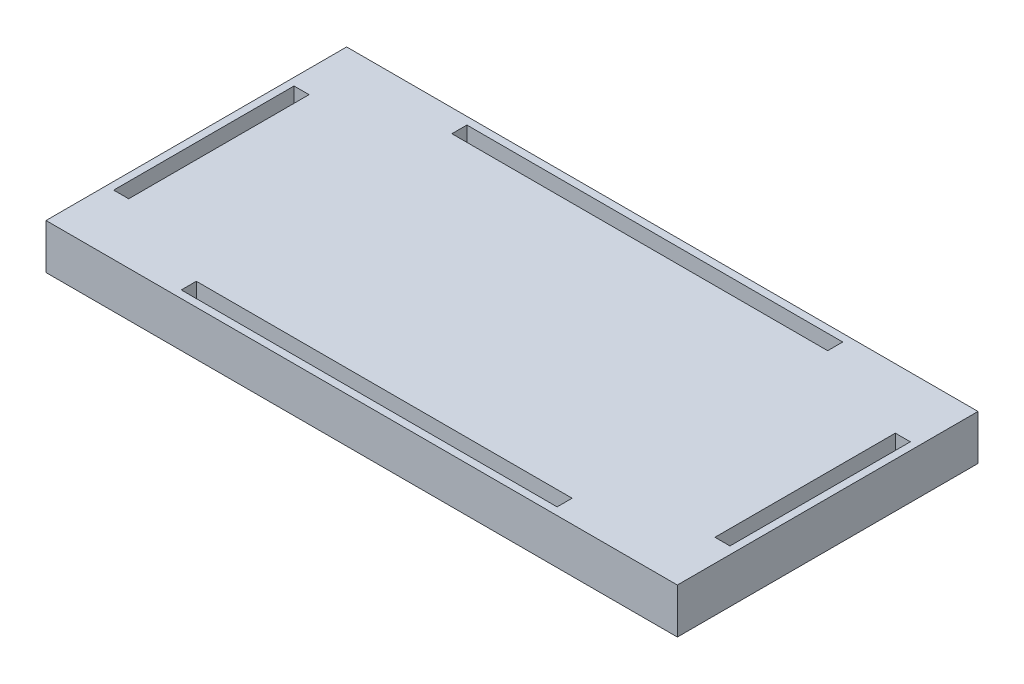
ISO-10303-21;
HEADER;
FILE_DESCRIPTION(('STEP AP214'),'2;1');
FILE_NAME('part.step','',(''),(''),'','','');
FILE_SCHEMA(('AUTOMOTIVE_DESIGN { 1 0 10303 214 1 1 1 1 }'));
ENDSEC;
DATA;
#1=APPLICATION_CONTEXT('core data for automotive mechanical design processes');
#2=APPLICATION_PROTOCOL_DEFINITION('international standard','automotive_design',2000,#1);
#3=PRODUCT_CONTEXT('',#1,'mechanical');
#4=PRODUCT('Part','Part','',(#3));
#5=PRODUCT_RELATED_PRODUCT_CATEGORY('part','',(#4));
#6=PRODUCT_DEFINITION_FORMATION('','',#4);
#7=PRODUCT_DEFINITION_CONTEXT('part definition',#1,'design');
#8=PRODUCT_DEFINITION('design','',#6,#7);
#9=PRODUCT_DEFINITION_SHAPE('','',#8);
#10=(LENGTH_UNIT() NAMED_UNIT(*) SI_UNIT(.MILLI.,.METRE.));
#11=(NAMED_UNIT(*) PLANE_ANGLE_UNIT() SI_UNIT($,.RADIAN.));
#12=(NAMED_UNIT(*) SI_UNIT($,.STERADIAN.) SOLID_ANGLE_UNIT());
#13=UNCERTAINTY_MEASURE_WITH_UNIT(LENGTH_MEASURE(1.E-05),#10,'distance_accuracy_value','');
#14=(GEOMETRIC_REPRESENTATION_CONTEXT(3) GLOBAL_UNCERTAINTY_ASSIGNED_CONTEXT((#13)) GLOBAL_UNIT_ASSIGNED_CONTEXT((#10,
#11,#12)) REPRESENTATION_CONTEXT('',''));
#15=CARTESIAN_POINT('',(0.,0.,0.));
#16=DIRECTION('',(0.,0.,1.));
#17=DIRECTION('',(1.,0.,0.));
#18=AXIS2_PLACEMENT_3D('',#15,#16,#17);
#19=CARTESIAN_POINT('',(103.,15.,50.));
#20=DIRECTION('',(0.,0.,-1.));
#21=DIRECTION('',(-1.,0.,0.));
#22=AXIS2_PLACEMENT_3D('',#19,#20,#21);
#23=PLANE('',#22);
#24=DIRECTION('',(1.,0.,0.));
#25=VECTOR('',#24,1.);
#26=CARTESIAN_POINT('',(103.,0.,50.));
#27=LINE('',#26,#25);
#28=CARTESIAN_POINT('',(-105.,0.,50.));
#29=VERTEX_POINT('',#28);
#30=CARTESIAN_POINT('',(105.,0.,50.));
#31=VERTEX_POINT('',#30);
#32=EDGE_CURVE('E211',#29,#31,#27,.T.);
#33=ORIENTED_EDGE('',*,*,#32,.T.);
#34=DIRECTION('',(0.,-1.,0.));
#35=VECTOR('',#34,1.);
#36=CARTESIAN_POINT('',(105.,15.,50.));
#37=LINE('',#36,#35);
#38=CARTESIAN_POINT('',(105.,15.,50.));
#39=VERTEX_POINT('',#38);
#40=EDGE_CURVE('E46',#39,#31,#37,.T.);
#41=ORIENTED_EDGE('',*,*,#40,.F.);
#42=DIRECTION('',(1.,0.,0.));
#43=VECTOR('',#42,1.);
#44=CARTESIAN_POINT('',(-105.,15.,50.));
#45=LINE('',#44,#43);
#46=CARTESIAN_POINT('',(-105.,15.,50.));
#47=VERTEX_POINT('',#46);
#48=EDGE_CURVE('E311',#47,#39,#45,.T.);
#49=ORIENTED_EDGE('',*,*,#48,.F.);
#50=DIRECTION('',(0.,-1.,0.));
#51=VECTOR('',#50,1.);
#52=CARTESIAN_POINT('',(-105.,15.,50.));
#53=LINE('',#52,#51);
#54=EDGE_CURVE('E11',#47,#29,#53,.T.);
#55=ORIENTED_EDGE('',*,*,#54,.T.);
#56=EDGE_LOOP('',(#33,#41,#49,#55));
#57=FACE_BOUND('',#56,.T.);
#58=ADVANCED_FACE('F39',(#57),#23,.F.);
#59=CARTESIAN_POINT('',(105.,15.,-48.));
#60=DIRECTION('',(-1.,0.,0.));
#61=DIRECTION('',(0.,0.,1.));
#62=AXIS2_PLACEMENT_3D('',#59,#60,#61);
#63=PLANE('',#62);
#64=DIRECTION('',(0.,0.,-1.));
#65=VECTOR('',#64,1.);
#66=CARTESIAN_POINT('',(105.,0.,-48.));
#67=LINE('',#66,#65);
#68=CARTESIAN_POINT('',(105.,0.,-50.));
#69=VERTEX_POINT('',#68);
#70=EDGE_CURVE('E321',#31,#69,#67,.T.);
#71=ORIENTED_EDGE('',*,*,#70,.T.);
#72=DIRECTION('',(0.,-1.,0.));
#73=VECTOR('',#72,1.);
#74=CARTESIAN_POINT('',(105.,15.,-50.));
#75=LINE('',#74,#73);
#76=CARTESIAN_POINT('',(105.,15.,-50.));
#77=VERTEX_POINT('',#76);
#78=EDGE_CURVE('E329',#77,#69,#75,.T.);
#79=ORIENTED_EDGE('',*,*,#78,.F.);
#80=DIRECTION('',(0.,0.,-1.));
#81=VECTOR('',#80,1.);
#82=CARTESIAN_POINT('',(105.,15.,50.));
#83=LINE('',#82,#81);
#84=EDGE_CURVE('E314',#39,#77,#83,.T.);
#85=ORIENTED_EDGE('',*,*,#84,.F.);
#86=ORIENTED_EDGE('',*,*,#40,.T.);
#87=EDGE_LOOP('',(#71,#79,#85,#86));
#88=FACE_BOUND('',#87,.T.);
#89=ADVANCED_FACE('F335',(#88),#63,.F.);
#90=CARTESIAN_POINT('',(-105.,15.,-50.));
#91=DIRECTION('',(0.,0.,-1.));
#92=DIRECTION('',(-1.,0.,0.));
#93=AXIS2_PLACEMENT_3D('',#90,#91,#92);
#94=PLANE('',#93);
#95=DIRECTION('',(1.,0.,0.));
#96=VECTOR('',#95,1.);
#97=CARTESIAN_POINT('',(-105.,0.,-50.));
#98=LINE('',#97,#96);
#99=CARTESIAN_POINT('',(-105.,0.,-50.));
#100=VERTEX_POINT('',#99);
#101=EDGE_CURVE('E324',#100,#69,#98,.T.);
#102=ORIENTED_EDGE('',*,*,#101,.F.);
#103=DIRECTION('',(0.,-1.,0.));
#104=VECTOR('',#103,1.);
#105=CARTESIAN_POINT('',(-105.,15.,-50.));
#106=LINE('',#105,#104);
#107=CARTESIAN_POINT('',(-105.,15.,-50.));
#108=VERTEX_POINT('',#107);
#109=EDGE_CURVE('E318',#108,#100,#106,.T.);
#110=ORIENTED_EDGE('',*,*,#109,.F.);
#111=DIRECTION('',(-1.,0.,0.));
#112=VECTOR('',#111,1.);
#113=CARTESIAN_POINT('',(105.,15.,-50.));
#114=LINE('',#113,#112);
#115=EDGE_CURVE('E316',#77,#108,#114,.T.);
#116=ORIENTED_EDGE('',*,*,#115,.F.);
#117=ORIENTED_EDGE('',*,*,#78,.T.);
#118=EDGE_LOOP('',(#102,#110,#116,#117));
#119=FACE_BOUND('',#118,.T.);
#120=ADVANCED_FACE('F349',(#119),#94,.T.);
#121=CARTESIAN_POINT('',(-105.,15.,48.));
#122=DIRECTION('',(-1.,0.,0.));
#123=DIRECTION('',(0.,0.,1.));
#124=AXIS2_PLACEMENT_3D('',#121,#122,#123);
#125=PLANE('',#124);
#126=DIRECTION('',(0.,0.,-1.));
#127=VECTOR('',#126,1.);
#128=CARTESIAN_POINT('',(-105.,0.,48.));
#129=LINE('',#128,#127);
#130=EDGE_CURVE('E312',#29,#100,#129,.T.);
#131=ORIENTED_EDGE('',*,*,#130,.F.);
#132=ORIENTED_EDGE('',*,*,#54,.F.);
#133=DIRECTION('',(0.,0.,1.));
#134=VECTOR('',#133,1.);
#135=CARTESIAN_POINT('',(-105.,15.,48.));
#136=LINE('',#135,#134);
#137=EDGE_CURVE('E308',#108,#47,#136,.T.);
#138=ORIENTED_EDGE('',*,*,#137,.F.);
#139=ORIENTED_EDGE('',*,*,#109,.T.);
#140=EDGE_LOOP('',(#131,#132,#138,#139));
#141=FACE_BOUND('',#140,.T.);
#142=ADVANCED_FACE('F343',(#141),#125,.T.);
#143=CARTESIAN_POINT('',(0.,15.,0.));
#144=DIRECTION('',(0.,1.,0.));
#145=DIRECTION('',(0.,0.,1.));
#146=AXIS2_PLACEMENT_3D('',#143,#144,#145);
#147=PLANE('',#146);
#148=DIRECTION('',(0.,0.,1.));
#149=VECTOR('',#148,1.);
#150=CARTESIAN_POINT('',(-102.5,15.,30.0000000000001));
#151=LINE('',#150,#149);
#152=CARTESIAN_POINT('',(-102.5,15.,-29.9999999999999));
#153=VERTEX_POINT('',#152);
#154=CARTESIAN_POINT('',(-102.5,15.,30.0000000000001));
#155=VERTEX_POINT('',#154);
#156=EDGE_CURVE('E53',#153,#155,#151,.T.);
#157=ORIENTED_EDGE('',*,*,#156,.F.);
#158=DIRECTION('',(-1.,0.,0.));
#159=VECTOR('',#158,1.);
#160=CARTESIAN_POINT('',(-97.5,15.,-29.9999999999999));
#161=LINE('',#160,#159);
#162=CARTESIAN_POINT('',(-97.5,15.,-29.9999999999999));
#163=VERTEX_POINT('',#162);
#164=EDGE_CURVE('E195',#163,#153,#161,.T.);
#165=ORIENTED_EDGE('',*,*,#164,.F.);
#166=DIRECTION('',(0.,0.,-1.));
#167=VECTOR('',#166,1.);
#168=CARTESIAN_POINT('',(-97.5,15.,30.0000000000001));
#169=LINE('',#168,#167);
#170=CARTESIAN_POINT('',(-97.5,15.,30.0000000000001));
#171=VERTEX_POINT('',#170);
#172=EDGE_CURVE('E198',#171,#163,#169,.T.);
#173=ORIENTED_EDGE('',*,*,#172,.F.);
#174=DIRECTION('',(1.,0.,0.));
#175=VECTOR('',#174,1.);
#176=CARTESIAN_POINT('',(-97.5,15.,30.0000000000001));
#177=LINE('',#176,#175);
#178=EDGE_CURVE('E204',#155,#171,#177,.T.);
#179=ORIENTED_EDGE('',*,*,#178,.F.);
#180=EDGE_LOOP('',(#157,#165,#173,#179));
#181=FACE_BOUND('',#180,.T.);
#182=DIRECTION('',(0.,0.,1.));
#183=VECTOR('',#182,1.);
#184=CARTESIAN_POINT('',(97.5000000000001,15.,30.0000000000001));
#185=LINE('',#184,#183);
#186=CARTESIAN_POINT('',(97.5000000000001,15.,-29.9999999999999));
#187=VERTEX_POINT('',#186);
#188=CARTESIAN_POINT('',(97.5000000000001,15.,30.0000000000001));
#189=VERTEX_POINT('',#188);
#190=EDGE_CURVE('E61',#187,#189,#185,.T.);
#191=ORIENTED_EDGE('',*,*,#190,.F.);
#192=DIRECTION('',(-1.,0.,0.));
#193=VECTOR('',#192,1.);
#194=CARTESIAN_POINT('',(97.5000000000001,15.,-29.9999999999999));
#195=LINE('',#194,#193);
#196=CARTESIAN_POINT('',(102.5,15.,-29.9999999999999));
#197=VERTEX_POINT('',#196);
#198=EDGE_CURVE('E219',#197,#187,#195,.T.);
#199=ORIENTED_EDGE('',*,*,#198,.F.);
#200=DIRECTION('',(0.,0.,-1.));
#201=VECTOR('',#200,1.);
#202=CARTESIAN_POINT('',(102.5,15.,30.0000000000001));
#203=LINE('',#202,#201);
#204=CARTESIAN_POINT('',(102.5,15.,30.0000000000001));
#205=VERTEX_POINT('',#204);
#206=EDGE_CURVE('E234',#205,#197,#203,.T.);
#207=ORIENTED_EDGE('',*,*,#206,.F.);
#208=DIRECTION('',(1.,0.,0.));
#209=VECTOR('',#208,1.);
#210=CARTESIAN_POINT('',(97.5000000000001,15.,30.0000000000001));
#211=LINE('',#210,#209);
#212=EDGE_CURVE('E230',#189,#205,#211,.T.);
#213=ORIENTED_EDGE('',*,*,#212,.F.);
#214=EDGE_LOOP('',(#191,#199,#207,#213));
#215=FACE_BOUND('',#214,.T.);
#216=DIRECTION('',(0.,0.,1.));
#217=VECTOR('',#216,1.);
#218=CARTESIAN_POINT('',(-62.4999999999999,15.,-42.5));
#219=LINE('',#218,#217);
#220=CARTESIAN_POINT('',(-62.4999999999999,15.,-47.5));
#221=VERTEX_POINT('',#220);
#222=CARTESIAN_POINT('',(-62.4999999999999,15.,-42.5));
#223=VERTEX_POINT('',#222);
#224=EDGE_CURVE('E259',#221,#223,#219,.T.);
#225=ORIENTED_EDGE('',*,*,#224,.F.);
#226=DIRECTION('',(-1.,0.,0.));
#227=VECTOR('',#226,1.);
#228=CARTESIAN_POINT('',(62.5000000000001,15.,-47.5));
#229=LINE('',#228,#227);
#230=CARTESIAN_POINT('',(62.5000000000001,15.,-47.5));
#231=VERTEX_POINT('',#230);
#232=EDGE_CURVE('E249',#231,#221,#229,.T.);
#233=ORIENTED_EDGE('',*,*,#232,.F.);
#234=DIRECTION('',(0.,0.,-1.));
#235=VECTOR('',#234,1.);
#236=CARTESIAN_POINT('',(62.5000000000001,15.,-42.5));
#237=LINE('',#236,#235);
#238=CARTESIAN_POINT('',(62.5000000000001,15.,-42.5));
#239=VERTEX_POINT('',#238);
#240=EDGE_CURVE('E265',#239,#231,#237,.T.);
#241=ORIENTED_EDGE('',*,*,#240,.F.);
#242=DIRECTION('',(1.,0.,0.));
#243=VECTOR('',#242,1.);
#244=CARTESIAN_POINT('',(62.5000000000001,15.,-42.5));
#245=LINE('',#244,#243);
#246=EDGE_CURVE('E261',#223,#239,#245,.T.);
#247=ORIENTED_EDGE('',*,*,#246,.F.);
#248=EDGE_LOOP('',(#225,#233,#241,#247));
#249=FACE_BOUND('',#248,.T.);
#250=DIRECTION('',(0.,0.,-1.));
#251=VECTOR('',#250,1.);
#252=CARTESIAN_POINT('',(62.5000000000001,15.,42.5));
#253=LINE('',#252,#251);
#254=CARTESIAN_POINT('',(62.5000000000001,15.,47.5));
#255=VERTEX_POINT('',#254);
#256=CARTESIAN_POINT('',(62.5000000000001,15.,42.5));
#257=VERTEX_POINT('',#256);
#258=EDGE_CURVE('E291',#255,#257,#253,.T.);
#259=ORIENTED_EDGE('',*,*,#258,.F.);
#260=DIRECTION('',(1.,0.,0.));
#261=VECTOR('',#260,1.);
#262=CARTESIAN_POINT('',(62.5000000000001,15.,47.5));
#263=LINE('',#262,#261);
#264=CARTESIAN_POINT('',(-62.4999999999999,15.,47.5));
#265=VERTEX_POINT('',#264);
#266=EDGE_CURVE('E281',#265,#255,#263,.T.);
#267=ORIENTED_EDGE('',*,*,#266,.F.);
#268=DIRECTION('',(0.,0.,1.));
#269=VECTOR('',#268,1.);
#270=CARTESIAN_POINT('',(-62.4999999999999,15.,42.5));
#271=LINE('',#270,#269);
#272=CARTESIAN_POINT('',(-62.4999999999999,15.,42.5));
#273=VERTEX_POINT('',#272);
#274=EDGE_CURVE('E296',#273,#265,#271,.T.);
#275=ORIENTED_EDGE('',*,*,#274,.F.);
#276=DIRECTION('',(-1.,0.,0.));
#277=VECTOR('',#276,1.);
#278=CARTESIAN_POINT('',(62.5000000000001,15.,42.5));
#279=LINE('',#278,#277);
#280=EDGE_CURVE('E293',#257,#273,#279,.T.);
#281=ORIENTED_EDGE('',*,*,#280,.F.);
#282=EDGE_LOOP('',(#259,#267,#275,#281));
#283=FACE_BOUND('',#282,.T.);
#284=ORIENTED_EDGE('',*,*,#137,.T.);
#285=ORIENTED_EDGE('',*,*,#48,.T.);
#286=ORIENTED_EDGE('',*,*,#84,.T.);
#287=ORIENTED_EDGE('',*,*,#115,.T.);
#288=EDGE_LOOP('',(#284,#285,#286,#287));
#289=FACE_BOUND('',#288,.T.);
#290=ADVANCED_FACE('F351',(#181,#215,#249,#283,#289),#147,.T.);
#291=CARTESIAN_POINT('',(0.,0.,0.));
#292=DIRECTION('',(0.,1.,0.));
#293=DIRECTION('',(0.,0.,1.));
#294=AXIS2_PLACEMENT_3D('',#291,#292,#293);
#295=PLANE('',#294);
#296=ORIENTED_EDGE('',*,*,#32,.F.);
#297=ORIENTED_EDGE('',*,*,#130,.T.);
#298=ORIENTED_EDGE('',*,*,#101,.T.);
#299=ORIENTED_EDGE('',*,*,#70,.F.);
#300=EDGE_LOOP('',(#296,#297,#298,#299));
#301=FACE_BOUND('',#300,.T.);
#302=ADVANCED_FACE('F341',(#301),#295,.F.);
#303=CARTESIAN_POINT('',(62.5000000000001,10.,42.5));
#304=DIRECTION('',(1.,0.,0.));
#305=DIRECTION('',(0.,0.,-1.));
#306=AXIS2_PLACEMENT_3D('',#303,#304,#305);
#307=PLANE('',#306);
#308=ORIENTED_EDGE('',*,*,#258,.T.);
#309=DIRECTION('',(0.,1.,0.));
#310=VECTOR('',#309,1.);
#311=CARTESIAN_POINT('',(62.5000000000001,10.,42.5));
#312=LINE('',#311,#310);
#313=CARTESIAN_POINT('',(62.5000000000001,10.,42.5));
#314=VERTEX_POINT('',#313);
#315=EDGE_CURVE('E290',#314,#257,#312,.T.);
#316=ORIENTED_EDGE('',*,*,#315,.F.);
#317=DIRECTION('',(0.,0.,-1.));
#318=VECTOR('',#317,1.);
#319=CARTESIAN_POINT('',(62.5000000000001,10.,42.5));
#320=LINE('',#319,#318);
#321=CARTESIAN_POINT('',(62.5000000000001,10.,47.5));
#322=VERTEX_POINT('',#321);
#323=EDGE_CURVE('E277',#322,#314,#320,.T.);
#324=ORIENTED_EDGE('',*,*,#323,.F.);
#325=DIRECTION('',(0.,1.,0.));
#326=VECTOR('',#325,1.);
#327=CARTESIAN_POINT('',(62.5000000000001,10.,47.5));
#328=LINE('',#327,#326);
#329=EDGE_CURVE('E262',#322,#255,#328,.T.);
#330=ORIENTED_EDGE('',*,*,#329,.T.);
#331=EDGE_LOOP('',(#308,#316,#324,#330));
#332=FACE_BOUND('',#331,.T.);
#333=ADVANCED_FACE('F359',(#332),#307,.F.);
#334=CARTESIAN_POINT('',(62.5000000000001,10.,47.5));
#335=DIRECTION('',(0.,0.,1.));
#336=DIRECTION('',(1.,0.,0.));
#337=AXIS2_PLACEMENT_3D('',#334,#335,#336);
#338=PLANE('',#337);
#339=ORIENTED_EDGE('',*,*,#266,.T.);
#340=ORIENTED_EDGE('',*,*,#329,.F.);
#341=DIRECTION('',(1.,0.,0.));
#342=VECTOR('',#341,1.);
#343=CARTESIAN_POINT('',(62.5000000000001,10.,47.5));
#344=LINE('',#343,#342);
#345=CARTESIAN_POINT('',(-62.4999999999999,10.,47.5));
#346=VERTEX_POINT('',#345);
#347=EDGE_CURVE('E287',#346,#322,#344,.T.);
#348=ORIENTED_EDGE('',*,*,#347,.F.);
#349=DIRECTION('',(0.,1.,0.));
#350=VECTOR('',#349,1.);
#351=CARTESIAN_POINT('',(-62.4999999999999,10.,47.5));
#352=LINE('',#351,#350);
#353=EDGE_CURVE('E302',#346,#265,#352,.T.);
#354=ORIENTED_EDGE('',*,*,#353,.T.);
#355=EDGE_LOOP('',(#339,#340,#348,#354));
#356=FACE_BOUND('',#355,.T.);
#357=ADVANCED_FACE('F394',(#356),#338,.F.);
#358=CARTESIAN_POINT('',(-62.4999999999999,10.,42.5));
#359=DIRECTION('',(-1.,0.,0.));
#360=DIRECTION('',(0.,0.,1.));
#361=AXIS2_PLACEMENT_3D('',#358,#359,#360);
#362=PLANE('',#361);
#363=ORIENTED_EDGE('',*,*,#274,.T.);
#364=ORIENTED_EDGE('',*,*,#353,.F.);
#365=DIRECTION('',(0.,0.,1.));
#366=VECTOR('',#365,1.);
#367=CARTESIAN_POINT('',(-62.4999999999999,10.,42.5));
#368=LINE('',#367,#366);
#369=CARTESIAN_POINT('',(-62.4999999999999,10.,42.5));
#370=VERTEX_POINT('',#369);
#371=EDGE_CURVE('E284',#370,#346,#368,.T.);
#372=ORIENTED_EDGE('',*,*,#371,.F.);
#373=DIRECTION('',(0.,1.,0.));
#374=VECTOR('',#373,1.);
#375=CARTESIAN_POINT('',(-62.4999999999999,10.,42.5));
#376=LINE('',#375,#374);
#377=EDGE_CURVE('E304',#370,#273,#376,.T.);
#378=ORIENTED_EDGE('',*,*,#377,.T.);
#379=EDGE_LOOP('',(#363,#364,#372,#378));
#380=FACE_BOUND('',#379,.T.);
#381=ADVANCED_FACE('F401',(#380),#362,.F.);
#382=CARTESIAN_POINT('',(62.5000000000001,10.,42.5));
#383=DIRECTION('',(0.,0.,-1.));
#384=DIRECTION('',(-1.,0.,0.));
#385=AXIS2_PLACEMENT_3D('',#382,#383,#384);
#386=PLANE('',#385);
#387=ORIENTED_EDGE('',*,*,#280,.T.);
#388=ORIENTED_EDGE('',*,*,#377,.F.);
#389=DIRECTION('',(-1.,0.,0.));
#390=VECTOR('',#389,1.);
#391=CARTESIAN_POINT('',(62.5000000000001,10.,42.5));
#392=LINE('',#391,#390);
#393=EDGE_CURVE('E280',#314,#370,#392,.T.);
#394=ORIENTED_EDGE('',*,*,#393,.F.);
#395=ORIENTED_EDGE('',*,*,#315,.T.);
#396=EDGE_LOOP('',(#387,#388,#394,#395));
#397=FACE_BOUND('',#396,.T.);
#398=ADVANCED_FACE('F409',(#397),#386,.F.);
#399=CARTESIAN_POINT('',(0.,10.,0.));
#400=DIRECTION('',(0.,-1.,0.));
#401=DIRECTION('',(0.,0.,-1.));
#402=AXIS2_PLACEMENT_3D('',#399,#400,#401);
#403=PLANE('',#402);
#404=ORIENTED_EDGE('',*,*,#323,.T.);
#405=ORIENTED_EDGE('',*,*,#393,.T.);
#406=ORIENTED_EDGE('',*,*,#371,.T.);
#407=ORIENTED_EDGE('',*,*,#347,.T.);
#408=EDGE_LOOP('',(#404,#405,#406,#407));
#409=FACE_BOUND('',#408,.T.);
#410=ADVANCED_FACE('F417',(#409),#403,.F.);
#411=CARTESIAN_POINT('',(-62.4999999999999,10.,-42.5));
#412=DIRECTION('',(-1.,0.,0.));
#413=DIRECTION('',(0.,0.,1.));
#414=AXIS2_PLACEMENT_3D('',#411,#412,#413);
#415=PLANE('',#414);
#416=ORIENTED_EDGE('',*,*,#224,.T.);
#417=DIRECTION('',(0.,1.,0.));
#418=VECTOR('',#417,1.);
#419=CARTESIAN_POINT('',(-62.4999999999999,10.,-42.5));
#420=LINE('',#419,#418);
#421=CARTESIAN_POINT('',(-62.4999999999999,10.,-42.5));
#422=VERTEX_POINT('',#421);
#423=EDGE_CURVE('E258',#422,#223,#420,.T.);
#424=ORIENTED_EDGE('',*,*,#423,.F.);
#425=DIRECTION('',(0.,0.,1.));
#426=VECTOR('',#425,1.);
#427=CARTESIAN_POINT('',(-62.4999999999999,10.,-42.5));
#428=LINE('',#427,#426);
#429=CARTESIAN_POINT('',(-62.4999999999999,10.,-47.5));
#430=VERTEX_POINT('',#429);
#431=EDGE_CURVE('E245',#430,#422,#428,.T.);
#432=ORIENTED_EDGE('',*,*,#431,.F.);
#433=DIRECTION('',(0.,1.,0.));
#434=VECTOR('',#433,1.);
#435=CARTESIAN_POINT('',(-62.4999999999999,10.,-47.5));
#436=LINE('',#435,#434);
#437=EDGE_CURVE('E231',#430,#221,#436,.T.);
#438=ORIENTED_EDGE('',*,*,#437,.T.);
#439=EDGE_LOOP('',(#416,#424,#432,#438));
#440=FACE_BOUND('',#439,.T.);
#441=ADVANCED_FACE('F425',(#440),#415,.F.);
#442=CARTESIAN_POINT('',(62.5000000000001,10.,-47.5));
#443=DIRECTION('',(0.,0.,-1.));
#444=DIRECTION('',(-1.,0.,0.));
#445=AXIS2_PLACEMENT_3D('',#442,#443,#444);
#446=PLANE('',#445);
#447=ORIENTED_EDGE('',*,*,#232,.T.);
#448=ORIENTED_EDGE('',*,*,#437,.F.);
#449=DIRECTION('',(-1.,0.,0.));
#450=VECTOR('',#449,1.);
#451=CARTESIAN_POINT('',(62.5000000000001,10.,-47.5));
#452=LINE('',#451,#450);
#453=CARTESIAN_POINT('',(62.5000000000001,10.,-47.5));
#454=VERTEX_POINT('',#453);
#455=EDGE_CURVE('E255',#454,#430,#452,.T.);
#456=ORIENTED_EDGE('',*,*,#455,.F.);
#457=DIRECTION('',(0.,1.,0.));
#458=VECTOR('',#457,1.);
#459=CARTESIAN_POINT('',(62.5000000000001,10.,-47.5));
#460=LINE('',#459,#458);
#461=EDGE_CURVE('E271',#454,#231,#460,.T.);
#462=ORIENTED_EDGE('',*,*,#461,.T.);
#463=EDGE_LOOP('',(#447,#448,#456,#462));
#464=FACE_BOUND('',#463,.T.);
#465=ADVANCED_FACE('F433',(#464),#446,.F.);
#466=CARTESIAN_POINT('',(62.5000000000001,10.,-42.5));
#467=DIRECTION('',(1.,0.,0.));
#468=DIRECTION('',(0.,0.,-1.));
#469=AXIS2_PLACEMENT_3D('',#466,#467,#468);
#470=PLANE('',#469);
#471=ORIENTED_EDGE('',*,*,#240,.T.);
#472=ORIENTED_EDGE('',*,*,#461,.F.);
#473=DIRECTION('',(0.,0.,-1.));
#474=VECTOR('',#473,1.);
#475=CARTESIAN_POINT('',(62.5000000000001,10.,-42.5));
#476=LINE('',#475,#474);
#477=CARTESIAN_POINT('',(62.5000000000001,10.,-42.5));
#478=VERTEX_POINT('',#477);
#479=EDGE_CURVE('E252',#478,#454,#476,.T.);
#480=ORIENTED_EDGE('',*,*,#479,.F.);
#481=DIRECTION('',(0.,1.,0.));
#482=VECTOR('',#481,1.);
#483=CARTESIAN_POINT('',(62.5000000000001,10.,-42.5));
#484=LINE('',#483,#482);
#485=EDGE_CURVE('E273',#478,#239,#484,.T.);
#486=ORIENTED_EDGE('',*,*,#485,.T.);
#487=EDGE_LOOP('',(#471,#472,#480,#486));
#488=FACE_BOUND('',#487,.T.);
#489=ADVANCED_FACE('F441',(#488),#470,.F.);
#490=CARTESIAN_POINT('',(62.5000000000001,10.,-42.5));
#491=DIRECTION('',(0.,0.,1.));
#492=DIRECTION('',(1.,0.,0.));
#493=AXIS2_PLACEMENT_3D('',#490,#491,#492);
#494=PLANE('',#493);
#495=ORIENTED_EDGE('',*,*,#246,.T.);
#496=ORIENTED_EDGE('',*,*,#485,.F.);
#497=DIRECTION('',(1.,0.,0.));
#498=VECTOR('',#497,1.);
#499=CARTESIAN_POINT('',(62.5000000000001,10.,-42.5));
#500=LINE('',#499,#498);
#501=EDGE_CURVE('E248',#422,#478,#500,.T.);
#502=ORIENTED_EDGE('',*,*,#501,.F.);
#503=ORIENTED_EDGE('',*,*,#423,.T.);
#504=EDGE_LOOP('',(#495,#496,#502,#503));
#505=FACE_BOUND('',#504,.T.);
#506=ADVANCED_FACE('F449',(#505),#494,.F.);
#507=CARTESIAN_POINT('',(0.,10.,0.));
#508=DIRECTION('',(0.,1.,0.));
#509=DIRECTION('',(0.,0.,1.));
#510=AXIS2_PLACEMENT_3D('',#507,#508,#509);
#511=PLANE('',#510);
#512=ORIENTED_EDGE('',*,*,#431,.T.);
#513=ORIENTED_EDGE('',*,*,#501,.T.);
#514=ORIENTED_EDGE('',*,*,#479,.T.);
#515=ORIENTED_EDGE('',*,*,#455,.T.);
#516=EDGE_LOOP('',(#512,#513,#514,#515));
#517=FACE_BOUND('',#516,.T.);
#518=ADVANCED_FACE('F457',(#517),#511,.T.);
#519=CARTESIAN_POINT('',(97.5000000000001,10.,30.0000000000001));
#520=DIRECTION('',(-1.,0.,0.));
#521=DIRECTION('',(0.,0.,1.));
#522=AXIS2_PLACEMENT_3D('',#519,#520,#521);
#523=PLANE('',#522);
#524=ORIENTED_EDGE('',*,*,#190,.T.);
#525=DIRECTION('',(0.,1.,0.));
#526=VECTOR('',#525,1.);
#527=CARTESIAN_POINT('',(97.5000000000001,10.,30.0000000000001));
#528=LINE('',#527,#526);
#529=CARTESIAN_POINT('',(97.5000000000001,10.,30.0000000000001));
#530=VERTEX_POINT('',#529);
#531=EDGE_CURVE('E228',#530,#189,#528,.T.);
#532=ORIENTED_EDGE('',*,*,#531,.F.);
#533=DIRECTION('',(0.,0.,1.));
#534=VECTOR('',#533,1.);
#535=CARTESIAN_POINT('',(97.5000000000001,10.,30.0000000000001));
#536=LINE('',#535,#534);
#537=CARTESIAN_POINT('',(97.5000000000001,10.,-29.9999999999999));
#538=VERTEX_POINT('',#537);
#539=EDGE_CURVE('E215',#538,#530,#536,.T.);
#540=ORIENTED_EDGE('',*,*,#539,.F.);
#541=DIRECTION('',(0.,1.,0.));
#542=VECTOR('',#541,1.);
#543=CARTESIAN_POINT('',(97.5000000000001,10.,-29.9999999999999));
#544=LINE('',#543,#542);
#545=EDGE_CURVE('E205',#538,#187,#544,.T.);
#546=ORIENTED_EDGE('',*,*,#545,.T.);
#547=EDGE_LOOP('',(#524,#532,#540,#546));
#548=FACE_BOUND('',#547,.T.);
#549=ADVANCED_FACE('F465',(#548),#523,.F.);
#550=CARTESIAN_POINT('',(97.5000000000001,10.,-29.9999999999999));
#551=DIRECTION('',(0.,0.,-1.));
#552=DIRECTION('',(-1.,0.,0.));
#553=AXIS2_PLACEMENT_3D('',#550,#551,#552);
#554=PLANE('',#553);
#555=ORIENTED_EDGE('',*,*,#198,.T.);
#556=ORIENTED_EDGE('',*,*,#545,.F.);
#557=DIRECTION('',(-1.,0.,0.));
#558=VECTOR('',#557,1.);
#559=CARTESIAN_POINT('',(97.5000000000001,10.,-29.9999999999999));
#560=LINE('',#559,#558);
#561=CARTESIAN_POINT('',(102.5,10.,-29.9999999999999));
#562=VERTEX_POINT('',#561);
#563=EDGE_CURVE('E225',#562,#538,#560,.T.);
#564=ORIENTED_EDGE('',*,*,#563,.F.);
#565=DIRECTION('',(0.,1.,0.));
#566=VECTOR('',#565,1.);
#567=CARTESIAN_POINT('',(102.5,10.,-29.9999999999999));
#568=LINE('',#567,#566);
#569=EDGE_CURVE('E240',#562,#197,#568,.T.);
#570=ORIENTED_EDGE('',*,*,#569,.T.);
#571=EDGE_LOOP('',(#555,#556,#564,#570));
#572=FACE_BOUND('',#571,.T.);
#573=ADVANCED_FACE('F473',(#572),#554,.F.);
#574=CARTESIAN_POINT('',(102.5,10.,30.0000000000001));
#575=DIRECTION('',(1.,0.,0.));
#576=DIRECTION('',(0.,0.,-1.));
#577=AXIS2_PLACEMENT_3D('',#574,#575,#576);
#578=PLANE('',#577);
#579=ORIENTED_EDGE('',*,*,#206,.T.);
#580=ORIENTED_EDGE('',*,*,#569,.F.);
#581=DIRECTION('',(0.,0.,-1.));
#582=VECTOR('',#581,1.);
#583=CARTESIAN_POINT('',(102.5,10.,30.0000000000001));
#584=LINE('',#583,#582);
#585=CARTESIAN_POINT('',(102.5,10.,30.0000000000001));
#586=VERTEX_POINT('',#585);
#587=EDGE_CURVE('E222',#586,#562,#584,.T.);
#588=ORIENTED_EDGE('',*,*,#587,.F.);
#589=DIRECTION('',(0.,1.,0.));
#590=VECTOR('',#589,1.);
#591=CARTESIAN_POINT('',(102.5,10.,30.0000000000001));
#592=LINE('',#591,#590);
#593=EDGE_CURVE('E242',#586,#205,#592,.T.);
#594=ORIENTED_EDGE('',*,*,#593,.T.);
#595=EDGE_LOOP('',(#579,#580,#588,#594));
#596=FACE_BOUND('',#595,.T.);
#597=ADVANCED_FACE('F480',(#596),#578,.F.);
#598=CARTESIAN_POINT('',(97.5000000000001,10.,30.0000000000001));
#599=DIRECTION('',(0.,0.,1.));
#600=DIRECTION('',(1.,0.,0.));
#601=AXIS2_PLACEMENT_3D('',#598,#599,#600);
#602=PLANE('',#601);
#603=ORIENTED_EDGE('',*,*,#212,.T.);
#604=ORIENTED_EDGE('',*,*,#593,.F.);
#605=DIRECTION('',(1.,0.,0.));
#606=VECTOR('',#605,1.);
#607=CARTESIAN_POINT('',(97.5000000000001,10.,30.0000000000001));
#608=LINE('',#607,#606);
#609=EDGE_CURVE('E218',#530,#586,#608,.T.);
#610=ORIENTED_EDGE('',*,*,#609,.F.);
#611=ORIENTED_EDGE('',*,*,#531,.T.);
#612=EDGE_LOOP('',(#603,#604,#610,#611));
#613=FACE_BOUND('',#612,.T.);
#614=ADVANCED_FACE('F488',(#613),#602,.F.);
#615=CARTESIAN_POINT('',(0.,10.,0.));
#616=DIRECTION('',(0.,-1.,0.));
#617=DIRECTION('',(0.,0.,-1.));
#618=AXIS2_PLACEMENT_3D('',#615,#616,#617);
#619=PLANE('',#618);
#620=ORIENTED_EDGE('',*,*,#539,.T.);
#621=ORIENTED_EDGE('',*,*,#609,.T.);
#622=ORIENTED_EDGE('',*,*,#587,.T.);
#623=ORIENTED_EDGE('',*,*,#563,.T.);
#624=EDGE_LOOP('',(#620,#621,#622,#623));
#625=FACE_BOUND('',#624,.T.);
#626=ADVANCED_FACE('F496',(#625),#619,.F.);
#627=CARTESIAN_POINT('',(-102.5,10.,30.0000000000001));
#628=DIRECTION('',(-1.,0.,0.));
#629=DIRECTION('',(0.,0.,1.));
#630=AXIS2_PLACEMENT_3D('',#627,#628,#629);
#631=PLANE('',#630);
#632=ORIENTED_EDGE('',*,*,#156,.T.);
#633=DIRECTION('',(0.,1.,0.));
#634=VECTOR('',#633,1.);
#635=CARTESIAN_POINT('',(-102.5,10.,30.0000000000001));
#636=LINE('',#635,#634);
#637=CARTESIAN_POINT('',(-102.5,10.,30.0000000000001));
#638=VERTEX_POINT('',#637);
#639=EDGE_CURVE('E173',#638,#155,#636,.T.);
#640=ORIENTED_EDGE('',*,*,#639,.F.);
#641=DIRECTION('',(0.,0.,1.));
#642=VECTOR('',#641,1.);
#643=CARTESIAN_POINT('',(-102.5,10.,30.0000000000001));
#644=LINE('',#643,#642);
#645=CARTESIAN_POINT('',(-102.5,10.,-29.9999999999999));
#646=VERTEX_POINT('',#645);
#647=EDGE_CURVE('E177',#646,#638,#644,.T.);
#648=ORIENTED_EDGE('',*,*,#647,.F.);
#649=DIRECTION('',(0.,1.,0.));
#650=VECTOR('',#649,1.);
#651=CARTESIAN_POINT('',(-102.5,10.,-29.9999999999999));
#652=LINE('',#651,#650);
#653=EDGE_CURVE('E209',#646,#153,#652,.T.);
#654=ORIENTED_EDGE('',*,*,#653,.T.);
#655=EDGE_LOOP('',(#632,#640,#648,#654));
#656=FACE_BOUND('',#655,.T.);
#657=ADVANCED_FACE('F175',(#656),#631,.F.);
#658=CARTESIAN_POINT('',(-97.5,10.,-29.9999999999999));
#659=DIRECTION('',(0.,0.,-1.));
#660=DIRECTION('',(-1.,0.,0.));
#661=AXIS2_PLACEMENT_3D('',#658,#659,#660);
#662=PLANE('',#661);
#663=ORIENTED_EDGE('',*,*,#164,.T.);
#664=ORIENTED_EDGE('',*,*,#653,.F.);
#665=DIRECTION('',(-1.,0.,0.));
#666=VECTOR('',#665,1.);
#667=CARTESIAN_POINT('',(-97.5,10.,-29.9999999999999));
#668=LINE('',#667,#666);
#669=CARTESIAN_POINT('',(-97.5,10.,-29.9999999999999));
#670=VERTEX_POINT('',#669);
#671=EDGE_CURVE('E183',#670,#646,#668,.T.);
#672=ORIENTED_EDGE('',*,*,#671,.F.);
#673=DIRECTION('',(0.,1.,0.));
#674=VECTOR('',#673,1.);
#675=CARTESIAN_POINT('',(-97.5,10.,-29.9999999999999));
#676=LINE('',#675,#674);
#677=EDGE_CURVE('E212',#670,#163,#676,.T.);
#678=ORIENTED_EDGE('',*,*,#677,.T.);
#679=EDGE_LOOP('',(#663,#664,#672,#678));
#680=FACE_BOUND('',#679,.T.);
#681=ADVANCED_FACE('F511',(#680),#662,.F.);
#682=CARTESIAN_POINT('',(-97.5,10.,30.0000000000001));
#683=DIRECTION('',(1.,0.,0.));
#684=DIRECTION('',(0.,0.,-1.));
#685=AXIS2_PLACEMENT_3D('',#682,#683,#684);
#686=PLANE('',#685);
#687=ORIENTED_EDGE('',*,*,#172,.T.);
#688=ORIENTED_EDGE('',*,*,#677,.F.);
#689=DIRECTION('',(0.,0.,-1.));
#690=VECTOR('',#689,1.);
#691=CARTESIAN_POINT('',(-97.5,10.,30.0000000000001));
#692=LINE('',#691,#690);
#693=CARTESIAN_POINT('',(-97.5,10.,30.0000000000001));
#694=VERTEX_POINT('',#693);
#695=EDGE_CURVE('E191',#694,#670,#692,.T.);
#696=ORIENTED_EDGE('',*,*,#695,.F.);
#697=DIRECTION('',(0.,1.,0.));
#698=VECTOR('',#697,1.);
#699=CARTESIAN_POINT('',(-97.5,10.,30.0000000000001));
#700=LINE('',#699,#698);
#701=EDGE_CURVE('E182',#694,#171,#700,.T.);
#702=ORIENTED_EDGE('',*,*,#701,.T.);
#703=EDGE_LOOP('',(#687,#688,#696,#702));
#704=FACE_BOUND('',#703,.T.);
#705=ADVANCED_FACE('F518',(#704),#686,.F.);
#706=CARTESIAN_POINT('',(-97.5,10.,30.0000000000001));
#707=DIRECTION('',(0.,0.,1.));
#708=DIRECTION('',(1.,0.,0.));
#709=AXIS2_PLACEMENT_3D('',#706,#707,#708);
#710=PLANE('',#709);
#711=ORIENTED_EDGE('',*,*,#178,.T.);
#712=ORIENTED_EDGE('',*,*,#701,.F.);
#713=DIRECTION('',(1.,0.,0.));
#714=VECTOR('',#713,1.);
#715=CARTESIAN_POINT('',(-97.5,10.,30.0000000000001));
#716=LINE('',#715,#714);
#717=EDGE_CURVE('E186',#638,#694,#716,.T.);
#718=ORIENTED_EDGE('',*,*,#717,.F.);
#719=ORIENTED_EDGE('',*,*,#639,.T.);
#720=EDGE_LOOP('',(#711,#712,#718,#719));
#721=FACE_BOUND('',#720,.T.);
#722=ADVANCED_FACE('F187',(#721),#710,.F.);
#723=CARTESIAN_POINT('',(0.,10.,0.));
#724=DIRECTION('',(0.,1.,0.));
#725=DIRECTION('',(0.,0.,1.));
#726=AXIS2_PLACEMENT_3D('',#723,#724,#725);
#727=PLANE('',#726);
#728=ORIENTED_EDGE('',*,*,#647,.T.);
#729=ORIENTED_EDGE('',*,*,#717,.T.);
#730=ORIENTED_EDGE('',*,*,#695,.T.);
#731=ORIENTED_EDGE('',*,*,#671,.T.);
#732=EDGE_LOOP('',(#728,#729,#730,#731));
#733=FACE_BOUND('',#732,.T.);
#734=ADVANCED_FACE('F193',(#733),#727,.T.);
#735=CLOSED_SHELL('',(#58,#89,#120,#142,#290,#302,#333,#357,#381,#398,#410,#441,#465,#489,#506,
#518,#549,#573,#597,#614,#626,#657,#681,#705,#722,#734));
#736=MANIFOLD_SOLID_BREP('B2',#735);
#737=ADVANCED_BREP_SHAPE_REPRESENTATION('',(#18,#736),#14);
#738=SHAPE_DEFINITION_REPRESENTATION(#9,#737);
ENDSEC;
END-ISO-10303-21;
